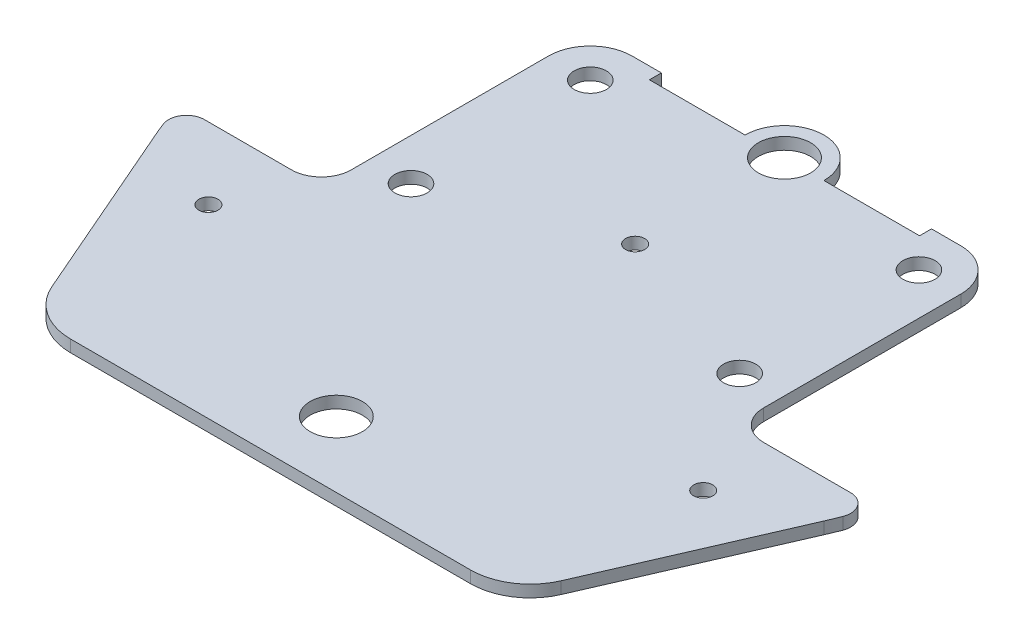
ISO-10303-21;
HEADER;
FILE_DESCRIPTION(('STEP AP214'),'2;1');
FILE_NAME('part.step','',(''),(''),'','','');
FILE_SCHEMA(('AUTOMOTIVE_DESIGN { 1 0 10303 214 1 1 1 1 }'));
ENDSEC;
DATA;
#1=APPLICATION_CONTEXT('core data for automotive mechanical design processes');
#2=APPLICATION_PROTOCOL_DEFINITION('international standard','automotive_design',2000,#1);
#3=PRODUCT_CONTEXT('',#1,'mechanical');
#4=PRODUCT('Part','Part','',(#3));
#5=PRODUCT_RELATED_PRODUCT_CATEGORY('part','',(#4));
#6=PRODUCT_DEFINITION_FORMATION('','',#4);
#7=PRODUCT_DEFINITION_CONTEXT('part definition',#1,'design');
#8=PRODUCT_DEFINITION('design','',#6,#7);
#9=PRODUCT_DEFINITION_SHAPE('','',#8);
#10=(LENGTH_UNIT() NAMED_UNIT(*) SI_UNIT(.MILLI.,.METRE.));
#11=(NAMED_UNIT(*) PLANE_ANGLE_UNIT() SI_UNIT($,.RADIAN.));
#12=(NAMED_UNIT(*) SI_UNIT($,.STERADIAN.) SOLID_ANGLE_UNIT());
#13=UNCERTAINTY_MEASURE_WITH_UNIT(LENGTH_MEASURE(1.E-05),#10,'distance_accuracy_value','');
#14=(GEOMETRIC_REPRESENTATION_CONTEXT(3) GLOBAL_UNCERTAINTY_ASSIGNED_CONTEXT((#13)) GLOBAL_UNIT_ASSIGNED_CONTEXT((#10,
#11,#12)) REPRESENTATION_CONTEXT('',''));
#15=CARTESIAN_POINT('',(0.,0.,0.));
#16=DIRECTION('',(0.,0.,1.));
#17=DIRECTION('',(1.,0.,0.));
#18=AXIS2_PLACEMENT_3D('',#15,#16,#17);
#19=CARTESIAN_POINT('',(34.5,2.,0.));
#20=DIRECTION('',(1.,0.,0.));
#21=DIRECTION('',(0.,0.,-1.));
#22=AXIS2_PLACEMENT_3D('',#19,#20,#21);
#23=PLANE('',#22);
#24=DIRECTION('',(0.,0.,1.));
#25=VECTOR('',#24,1.);
#26=CARTESIAN_POINT('',(34.5,2.,0.));
#27=LINE('',#26,#25);
#28=CARTESIAN_POINT('',(34.5,2.,-20.));
#29=VERTEX_POINT('',#28);
#30=CARTESIAN_POINT('',(34.5,2.,13.));
#31=VERTEX_POINT('',#30);
#32=EDGE_CURVE('E316',#29,#31,#27,.T.);
#33=ORIENTED_EDGE('',*,*,#32,.T.);
#34=DIRECTION('',(0.,1.,0.));
#35=VECTOR('',#34,1.);
#36=CARTESIAN_POINT('',(34.5,0.,13.));
#37=LINE('',#36,#35);
#38=CARTESIAN_POINT('',(34.5,0.,13.));
#39=VERTEX_POINT('',#38);
#40=EDGE_CURVE('E277',#39,#31,#37,.T.);
#41=ORIENTED_EDGE('',*,*,#40,.F.);
#42=DIRECTION('',(0.,0.,1.));
#43=VECTOR('',#42,1.);
#44=CARTESIAN_POINT('',(34.5,0.,0.));
#45=LINE('',#44,#43);
#46=CARTESIAN_POINT('',(34.5,0.,-20.));
#47=VERTEX_POINT('',#46);
#48=EDGE_CURVE('E311',#47,#39,#45,.T.);
#49=ORIENTED_EDGE('',*,*,#48,.F.);
#50=DIRECTION('',(0.,-1.,0.));
#51=VECTOR('',#50,1.);
#52=CARTESIAN_POINT('',(34.5,2.,-20.));
#53=LINE('',#52,#51);
#54=EDGE_CURVE('E419',#29,#47,#53,.T.);
#55=ORIENTED_EDGE('',*,*,#54,.F.);
#56=EDGE_LOOP('',(#33,#41,#49,#55));
#57=FACE_BOUND('',#56,.T.);
#58=ADVANCED_FACE('F81',(#57),#23,.T.);
#59=CARTESIAN_POINT('',(-34.5,2.,0.));
#60=DIRECTION('',(1.,0.,0.));
#61=DIRECTION('',(0.,0.,-1.));
#62=AXIS2_PLACEMENT_3D('',#59,#60,#61);
#63=PLANE('',#62);
#64=DIRECTION('',(0.,1.,0.));
#65=VECTOR('',#64,1.);
#66=CARTESIAN_POINT('',(-34.5,0.,13.));
#67=LINE('',#66,#65);
#68=CARTESIAN_POINT('',(-34.5,0.,13.));
#69=VERTEX_POINT('',#68);
#70=CARTESIAN_POINT('',(-34.5,2.,13.));
#71=VERTEX_POINT('',#70);
#72=EDGE_CURVE('E299',#69,#71,#67,.T.);
#73=ORIENTED_EDGE('',*,*,#72,.T.);
#74=DIRECTION('',(0.,0.,1.));
#75=VECTOR('',#74,1.);
#76=CARTESIAN_POINT('',(-34.5,2.,0.));
#77=LINE('',#76,#75);
#78=CARTESIAN_POINT('',(-34.5,2.,-20.));
#79=VERTEX_POINT('',#78);
#80=EDGE_CURVE('E344',#79,#71,#77,.T.);
#81=ORIENTED_EDGE('',*,*,#80,.F.);
#82=DIRECTION('',(0.,-1.,0.));
#83=VECTOR('',#82,1.);
#84=CARTESIAN_POINT('',(-34.5,2.,-20.));
#85=LINE('',#84,#83);
#86=CARTESIAN_POINT('',(-34.5,0.,-20.));
#87=VERTEX_POINT('',#86);
#88=EDGE_CURVE('E359',#79,#87,#85,.T.);
#89=ORIENTED_EDGE('',*,*,#88,.T.);
#90=DIRECTION('',(0.,0.,1.));
#91=VECTOR('',#90,1.);
#92=CARTESIAN_POINT('',(-34.5,0.,0.));
#93=LINE('',#92,#91);
#94=EDGE_CURVE('E387',#87,#69,#93,.T.);
#95=ORIENTED_EDGE('',*,*,#94,.T.);
#96=EDGE_LOOP('',(#73,#81,#89,#95));
#97=FACE_BOUND('',#96,.T.);
#98=ADVANCED_FACE('F468',(#97),#63,.F.);
#99=CARTESIAN_POINT('',(27.5,2.,-20.));
#100=DIRECTION('',(0.,-1.,0.));
#101=DIRECTION('',(0.,0.,-1.));
#102=AXIS2_PLACEMENT_3D('',#99,#100,#101);
#103=CYLINDRICAL_SURFACE('',#102,6.99999999999999);
#104=CARTESIAN_POINT('',(27.5,0.,-20.));
#105=DIRECTION('',(0.,1.,0.));
#106=DIRECTION('',(0.,0.,1.));
#107=AXIS2_PLACEMENT_3D('',#104,#105,#106);
#108=CIRCLE('',#107,6.99999999999999);
#109=CARTESIAN_POINT('',(27.5,0.,-27.));
#110=VERTEX_POINT('',#109);
#111=EDGE_CURVE('E362',#110,#47,#108,.F.);
#112=ORIENTED_EDGE('',*,*,#111,.F.);
#113=DIRECTION('',(0.,-1.,0.));
#114=VECTOR('',#113,1.);
#115=CARTESIAN_POINT('',(27.5,2.,-27.));
#116=LINE('',#115,#114);
#117=CARTESIAN_POINT('',(27.5,2.,-27.));
#118=VERTEX_POINT('',#117);
#119=EDGE_CURVE('E417',#118,#110,#116,.T.);
#120=ORIENTED_EDGE('',*,*,#119,.F.);
#121=CARTESIAN_POINT('',(27.5,2.,-20.));
#122=DIRECTION('',(0.,1.,0.));
#123=DIRECTION('',(0.,0.,1.));
#124=AXIS2_PLACEMENT_3D('',#121,#122,#123);
#125=CIRCLE('',#124,6.99999999999999);
#126=EDGE_CURVE('E319',#118,#29,#125,.F.);
#127=ORIENTED_EDGE('',*,*,#126,.T.);
#128=ORIENTED_EDGE('',*,*,#54,.T.);
#129=EDGE_LOOP('',(#112,#120,#127,#128));
#130=FACE_BOUND('',#129,.T.);
#131=ADVANCED_FACE('F474',(#130),#103,.T.);
#132=CARTESIAN_POINT('',(0.,2.,-27.0000000000001));
#133=DIRECTION('',(0.,0.,-1.));
#134=DIRECTION('',(-1.,0.,0.));
#135=AXIS2_PLACEMENT_3D('',#132,#133,#134);
#136=PLANE('',#135);
#137=DIRECTION('',(1.,0.,0.));
#138=VECTOR('',#137,1.);
#139=CARTESIAN_POINT('',(0.,0.,-27.0000000000001));
#140=LINE('',#139,#138);
#141=CARTESIAN_POINT('',(22.6010205144336,0.,-27.));
#142=VERTEX_POINT('',#141);
#143=EDGE_CURVE('E365',#142,#110,#140,.T.);
#144=ORIENTED_EDGE('',*,*,#143,.F.);
#145=DIRECTION('',(0.,-1.,0.));
#146=VECTOR('',#145,1.);
#147=CARTESIAN_POINT('',(22.6010205144336,2.,-27.));
#148=LINE('',#147,#146);
#149=CARTESIAN_POINT('',(22.6010205144336,2.,-27.));
#150=VERTEX_POINT('',#149);
#151=EDGE_CURVE('E415',#150,#142,#148,.T.);
#152=ORIENTED_EDGE('',*,*,#151,.F.);
#153=DIRECTION('',(1.,0.,0.));
#154=VECTOR('',#153,1.);
#155=CARTESIAN_POINT('',(0.,2.,-27.0000000000001));
#156=LINE('',#155,#154);
#157=EDGE_CURVE('E323',#150,#118,#156,.T.);
#158=ORIENTED_EDGE('',*,*,#157,.T.);
#159=ORIENTED_EDGE('',*,*,#119,.T.);
#160=EDGE_LOOP('',(#144,#152,#158,#159));
#161=FACE_BOUND('',#160,.T.);
#162=ADVANCED_FACE('F544',(#161),#136,.T.);
#163=CARTESIAN_POINT('',(22.6010205144336,2.,0.));
#164=DIRECTION('',(-1.,0.,0.));
#165=DIRECTION('',(0.,0.,1.));
#166=AXIS2_PLACEMENT_3D('',#163,#164,#165);
#167=PLANE('',#166);
#168=DIRECTION('',(0.,0.,-1.));
#169=VECTOR('',#168,1.);
#170=CARTESIAN_POINT('',(22.6010205144336,0.,0.));
#171=LINE('',#170,#169);
#172=CARTESIAN_POINT('',(22.6010205144336,0.,-25.));
#173=VERTEX_POINT('',#172);
#174=EDGE_CURVE('E368',#173,#142,#171,.T.);
#175=ORIENTED_EDGE('',*,*,#174,.F.);
#176=DIRECTION('',(0.,-1.,0.));
#177=VECTOR('',#176,1.);
#178=CARTESIAN_POINT('',(22.6010205144336,2.,-25.));
#179=LINE('',#178,#177);
#180=CARTESIAN_POINT('',(22.6010205144336,2.,-25.));
#181=VERTEX_POINT('',#180);
#182=EDGE_CURVE('E413',#181,#173,#179,.T.);
#183=ORIENTED_EDGE('',*,*,#182,.F.);
#184=DIRECTION('',(0.,0.,-1.));
#185=VECTOR('',#184,1.);
#186=CARTESIAN_POINT('',(22.6010205144336,2.,0.));
#187=LINE('',#186,#185);
#188=EDGE_CURVE('E326',#181,#150,#187,.T.);
#189=ORIENTED_EDGE('',*,*,#188,.T.);
#190=ORIENTED_EDGE('',*,*,#151,.T.);
#191=EDGE_LOOP('',(#175,#183,#189,#190));
#192=FACE_BOUND('',#191,.T.);
#193=ADVANCED_FACE('F540',(#192),#167,.T.);
#194=CARTESIAN_POINT('',(0.,2.,-25.));
#195=DIRECTION('',(0.,0.,-1.));
#196=DIRECTION('',(-1.,0.,0.));
#197=AXIS2_PLACEMENT_3D('',#194,#195,#196);
#198=PLANE('',#197);
#199=DIRECTION('',(1.,0.,0.));
#200=VECTOR('',#199,1.);
#201=CARTESIAN_POINT('',(0.,0.,-25.));
#202=LINE('',#201,#200);
#203=CARTESIAN_POINT('',(6.60102051443365,0.,-25.));
#204=VERTEX_POINT('',#203);
#205=EDGE_CURVE('E371',#204,#173,#202,.T.);
#206=ORIENTED_EDGE('',*,*,#205,.F.);
#207=DIRECTION('',(0.,-1.,0.));
#208=VECTOR('',#207,1.);
#209=CARTESIAN_POINT('',(6.60102051443365,2.,-25.));
#210=LINE('',#209,#208);
#211=CARTESIAN_POINT('',(6.60102051443365,2.,-25.));
#212=VERTEX_POINT('',#211);
#213=EDGE_CURVE('E411',#212,#204,#210,.T.);
#214=ORIENTED_EDGE('',*,*,#213,.F.);
#215=DIRECTION('',(1.,0.,0.));
#216=VECTOR('',#215,1.);
#217=CARTESIAN_POINT('',(0.,2.,-25.));
#218=LINE('',#217,#216);
#219=EDGE_CURVE('E329',#212,#181,#218,.T.);
#220=ORIENTED_EDGE('',*,*,#219,.T.);
#221=ORIENTED_EDGE('',*,*,#182,.T.);
#222=EDGE_LOOP('',(#206,#214,#220,#221));
#223=FACE_BOUND('',#222,.T.);
#224=ADVANCED_FACE('F536',(#223),#198,.T.);
#225=CARTESIAN_POINT('',(0.,2.,-25.));
#226=DIRECTION('',(0.,-1.,0.));
#227=DIRECTION('',(0.,0.,-1.));
#228=AXIS2_PLACEMENT_3D('',#225,#226,#227);
#229=CYLINDRICAL_SURFACE('',#228,6.60102051443364);
#230=CARTESIAN_POINT('',(0.,0.,-25.));
#231=DIRECTION('',(0.,1.,0.));
#232=DIRECTION('',(0.,0.,1.));
#233=AXIS2_PLACEMENT_3D('',#230,#231,#232);
#234=CIRCLE('',#233,6.60102051443364);
#235=CARTESIAN_POINT('',(-6.60102051443364,0.,-25.));
#236=VERTEX_POINT('',#235);
#237=EDGE_CURVE('E374',#204,#236,#234,.T.);
#238=ORIENTED_EDGE('',*,*,#237,.T.);
#239=DIRECTION('',(0.,-1.,0.));
#240=VECTOR('',#239,1.);
#241=CARTESIAN_POINT('',(-6.60102051443364,2.,-25.));
#242=LINE('',#241,#240);
#243=CARTESIAN_POINT('',(-6.60102051443364,2.,-25.));
#244=VERTEX_POINT('',#243);
#245=EDGE_CURVE('E408',#244,#236,#242,.T.);
#246=ORIENTED_EDGE('',*,*,#245,.F.);
#247=CARTESIAN_POINT('',(0.,2.,-25.));
#248=DIRECTION('',(0.,1.,0.));
#249=DIRECTION('',(0.,0.,1.));
#250=AXIS2_PLACEMENT_3D('',#247,#248,#249);
#251=CIRCLE('',#250,6.60102051443364);
#252=EDGE_CURVE('E332',#212,#244,#251,.T.);
#253=ORIENTED_EDGE('',*,*,#252,.F.);
#254=ORIENTED_EDGE('',*,*,#213,.T.);
#255=EDGE_LOOP('',(#238,#246,#253,#254));
#256=FACE_BOUND('',#255,.T.);
#257=ADVANCED_FACE('F532',(#256),#229,.T.);
#258=CARTESIAN_POINT('',(0.,2.,-25.));
#259=DIRECTION('',(0.,0.,1.));
#260=DIRECTION('',(1.,0.,0.));
#261=AXIS2_PLACEMENT_3D('',#258,#259,#260);
#262=PLANE('',#261);
#263=DIRECTION('',(-1.,0.,0.));
#264=VECTOR('',#263,1.);
#265=CARTESIAN_POINT('',(0.,0.,-25.));
#266=LINE('',#265,#264);
#267=CARTESIAN_POINT('',(-22.6010205144336,0.,-25.));
#268=VERTEX_POINT('',#267);
#269=EDGE_CURVE('E376',#236,#268,#266,.T.);
#270=ORIENTED_EDGE('',*,*,#269,.T.);
#271=DIRECTION('',(0.,-1.,0.));
#272=VECTOR('',#271,1.);
#273=CARTESIAN_POINT('',(-22.6010205144336,2.,-25.));
#274=LINE('',#273,#272);
#275=CARTESIAN_POINT('',(-22.6010205144336,2.,-25.));
#276=VERTEX_POINT('',#275);
#277=EDGE_CURVE('E406',#276,#268,#274,.T.);
#278=ORIENTED_EDGE('',*,*,#277,.F.);
#279=DIRECTION('',(-1.,0.,0.));
#280=VECTOR('',#279,1.);
#281=CARTESIAN_POINT('',(0.,2.,-25.));
#282=LINE('',#281,#280);
#283=EDGE_CURVE('E334',#244,#276,#282,.T.);
#284=ORIENTED_EDGE('',*,*,#283,.F.);
#285=ORIENTED_EDGE('',*,*,#245,.T.);
#286=EDGE_LOOP('',(#270,#278,#284,#285));
#287=FACE_BOUND('',#286,.T.);
#288=ADVANCED_FACE('F528',(#287),#262,.F.);
#289=CARTESIAN_POINT('',(-22.6010205144336,2.,0.));
#290=DIRECTION('',(1.,0.,0.));
#291=DIRECTION('',(0.,0.,-1.));
#292=AXIS2_PLACEMENT_3D('',#289,#290,#291);
#293=PLANE('',#292);
#294=DIRECTION('',(0.,0.,1.));
#295=VECTOR('',#294,1.);
#296=CARTESIAN_POINT('',(-22.6010205144336,0.,0.));
#297=LINE('',#296,#295);
#298=CARTESIAN_POINT('',(-22.6010205144336,0.,-27.));
#299=VERTEX_POINT('',#298);
#300=EDGE_CURVE('E379',#299,#268,#297,.T.);
#301=ORIENTED_EDGE('',*,*,#300,.F.);
#302=DIRECTION('',(0.,-1.,0.));
#303=VECTOR('',#302,1.);
#304=CARTESIAN_POINT('',(-22.6010205144336,2.,-27.));
#305=LINE('',#304,#303);
#306=CARTESIAN_POINT('',(-22.6010205144336,2.,-27.));
#307=VERTEX_POINT('',#306);
#308=EDGE_CURVE('E404',#307,#299,#305,.T.);
#309=ORIENTED_EDGE('',*,*,#308,.F.);
#310=DIRECTION('',(0.,0.,1.));
#311=VECTOR('',#310,1.);
#312=CARTESIAN_POINT('',(-22.6010205144336,2.,0.));
#313=LINE('',#312,#311);
#314=EDGE_CURVE('E336',#307,#276,#313,.T.);
#315=ORIENTED_EDGE('',*,*,#314,.T.);
#316=ORIENTED_EDGE('',*,*,#277,.T.);
#317=EDGE_LOOP('',(#301,#309,#315,#316));
#318=FACE_BOUND('',#317,.T.);
#319=ADVANCED_FACE('F523',(#318),#293,.T.);
#320=CARTESIAN_POINT('',(0.,2.,-27.));
#321=DIRECTION('',(0.,0.,-1.));
#322=DIRECTION('',(-1.,0.,0.));
#323=AXIS2_PLACEMENT_3D('',#320,#321,#322);
#324=PLANE('',#323);
#325=DIRECTION('',(1.,0.,0.));
#326=VECTOR('',#325,1.);
#327=CARTESIAN_POINT('',(0.,0.,-27.));
#328=LINE('',#327,#326);
#329=CARTESIAN_POINT('',(-27.5,0.,-27.));
#330=VERTEX_POINT('',#329);
#331=EDGE_CURVE('E382',#330,#299,#328,.T.);
#332=ORIENTED_EDGE('',*,*,#331,.F.);
#333=DIRECTION('',(0.,-1.,0.));
#334=VECTOR('',#333,1.);
#335=CARTESIAN_POINT('',(-27.5,2.,-27.));
#336=LINE('',#335,#334);
#337=CARTESIAN_POINT('',(-27.5,2.,-27.));
#338=VERTEX_POINT('',#337);
#339=EDGE_CURVE('E402',#338,#330,#336,.T.);
#340=ORIENTED_EDGE('',*,*,#339,.F.);
#341=DIRECTION('',(1.,0.,0.));
#342=VECTOR('',#341,1.);
#343=CARTESIAN_POINT('',(0.,2.,-27.));
#344=LINE('',#343,#342);
#345=EDGE_CURVE('E339',#338,#307,#344,.T.);
#346=ORIENTED_EDGE('',*,*,#345,.T.);
#347=ORIENTED_EDGE('',*,*,#308,.T.);
#348=EDGE_LOOP('',(#332,#340,#346,#347));
#349=FACE_BOUND('',#348,.T.);
#350=ADVANCED_FACE('F518',(#349),#324,.T.);
#351=CARTESIAN_POINT('',(-27.5,2.,-20.));
#352=DIRECTION('',(0.,-1.,0.));
#353=DIRECTION('',(0.,0.,-1.));
#354=AXIS2_PLACEMENT_3D('',#351,#352,#353);
#355=CYLINDRICAL_SURFACE('',#354,6.99999999999999);
#356=CARTESIAN_POINT('',(-27.5,0.,-20.));
#357=DIRECTION('',(0.,1.,0.));
#358=DIRECTION('',(0.,0.,1.));
#359=AXIS2_PLACEMENT_3D('',#356,#357,#358);
#360=CIRCLE('',#359,6.99999999999999);
#361=EDGE_CURVE('E385',#330,#87,#360,.T.);
#362=ORIENTED_EDGE('',*,*,#361,.T.);
#363=ORIENTED_EDGE('',*,*,#88,.F.);
#364=CARTESIAN_POINT('',(-27.5,2.,-20.));
#365=DIRECTION('',(0.,1.,0.));
#366=DIRECTION('',(0.,0.,1.));
#367=AXIS2_PLACEMENT_3D('',#364,#365,#366);
#368=CIRCLE('',#367,6.99999999999999);
#369=EDGE_CURVE('E342',#338,#79,#368,.T.);
#370=ORIENTED_EDGE('',*,*,#369,.F.);
#371=ORIENTED_EDGE('',*,*,#339,.T.);
#372=EDGE_LOOP('',(#362,#363,#370,#371));
#373=FACE_BOUND('',#372,.T.);
#374=ADVANCED_FACE('F515',(#373),#355,.T.);
#375=CARTESIAN_POINT('',(27.5,2.,9.99999999999999));
#376=DIRECTION('',(0.,-1.,0.));
#377=DIRECTION('',(0.,0.,-1.));
#378=AXIS2_PLACEMENT_3D('',#375,#376,#377);
#379=CYLINDRICAL_SURFACE('',#378,2.7);
#380=CARTESIAN_POINT('',(27.5,2.,9.99999999999999));
#381=DIRECTION('',(0.,1.,0.));
#382=DIRECTION('',(0.,0.,1.));
#383=AXIS2_PLACEMENT_3D('',#380,#381,#382);
#384=CIRCLE('',#383,2.7);
#385=CARTESIAN_POINT('',(27.5,2.,12.7));
#386=VERTEX_POINT('',#385);
#387=EDGE_CURVE('E353',#386,#386,#384,.F.);
#388=ORIENTED_EDGE('',*,*,#387,.F.);
#389=EDGE_LOOP('',(#388));
#390=FACE_BOUND('',#389,.T.);
#391=CARTESIAN_POINT('',(27.5,0.,9.99999999999999));
#392=DIRECTION('',(0.,1.,0.));
#393=DIRECTION('',(0.,0.,1.));
#394=AXIS2_PLACEMENT_3D('',#391,#392,#393);
#395=CIRCLE('',#394,2.7);
#396=CARTESIAN_POINT('',(27.5,0.,12.7));
#397=VERTEX_POINT('',#396);
#398=EDGE_CURVE('E395',#397,#397,#395,.F.);
#399=ORIENTED_EDGE('',*,*,#398,.T.);
#400=EDGE_LOOP('',(#399));
#401=FACE_BOUND('',#400,.T.);
#402=ADVANCED_FACE('F652',(#390,#401),#379,.F.);
#403=CARTESIAN_POINT('',(-27.5,2.,10.));
#404=DIRECTION('',(0.,-1.,0.));
#405=DIRECTION('',(0.,0.,-1.));
#406=AXIS2_PLACEMENT_3D('',#403,#404,#405);
#407=CYLINDRICAL_SURFACE('',#406,2.7);
#408=CARTESIAN_POINT('',(-27.5,2.,10.));
#409=DIRECTION('',(0.,1.,0.));
#410=DIRECTION('',(0.,0.,1.));
#411=AXIS2_PLACEMENT_3D('',#408,#409,#410);
#412=CIRCLE('',#411,2.7);
#413=CARTESIAN_POINT('',(-27.5,2.,12.7));
#414=VERTEX_POINT('',#413);
#415=EDGE_CURVE('E350',#414,#414,#412,.T.);
#416=ORIENTED_EDGE('',*,*,#415,.T.);
#417=EDGE_LOOP('',(#416));
#418=FACE_BOUND('',#417,.T.);
#419=CARTESIAN_POINT('',(-27.5,0.,10.));
#420=DIRECTION('',(0.,1.,0.));
#421=DIRECTION('',(0.,0.,1.));
#422=AXIS2_PLACEMENT_3D('',#419,#420,#421);
#423=CIRCLE('',#422,2.7);
#424=CARTESIAN_POINT('',(-27.5,0.,12.7));
#425=VERTEX_POINT('',#424);
#426=EDGE_CURVE('E392',#425,#425,#423,.T.);
#427=ORIENTED_EDGE('',*,*,#426,.F.);
#428=EDGE_LOOP('',(#427));
#429=FACE_BOUND('',#428,.T.);
#430=ADVANCED_FACE('F655',(#418,#429),#407,.F.);
#431=CARTESIAN_POINT('',(-27.5,2.,-20.));
#432=DIRECTION('',(0.,-1.,0.));
#433=DIRECTION('',(0.,0.,-1.));
#434=AXIS2_PLACEMENT_3D('',#431,#432,#433);
#435=CYLINDRICAL_SURFACE('',#434,2.7);
#436=CARTESIAN_POINT('',(-27.5,2.,-20.));
#437=DIRECTION('',(0.,1.,0.));
#438=DIRECTION('',(0.,0.,1.));
#439=AXIS2_PLACEMENT_3D('',#436,#437,#438);
#440=CIRCLE('',#439,2.7);
#441=CARTESIAN_POINT('',(-27.5,2.,-17.3));
#442=VERTEX_POINT('',#441);
#443=EDGE_CURVE('E347',#442,#442,#440,.T.);
#444=ORIENTED_EDGE('',*,*,#443,.T.);
#445=EDGE_LOOP('',(#444));
#446=FACE_BOUND('',#445,.T.);
#447=CARTESIAN_POINT('',(-27.5,0.,-20.));
#448=DIRECTION('',(0.,1.,0.));
#449=DIRECTION('',(0.,0.,1.));
#450=AXIS2_PLACEMENT_3D('',#447,#448,#449);
#451=CIRCLE('',#450,2.7);
#452=CARTESIAN_POINT('',(-27.5,0.,-17.3));
#453=VERTEX_POINT('',#452);
#454=EDGE_CURVE('E389',#453,#453,#451,.T.);
#455=ORIENTED_EDGE('',*,*,#454,.F.);
#456=EDGE_LOOP('',(#455));
#457=FACE_BOUND('',#456,.T.);
#458=ADVANCED_FACE('F650',(#446,#457),#435,.F.);
#459=CARTESIAN_POINT('',(27.5,2.,-20.));
#460=DIRECTION('',(0.,-1.,0.));
#461=DIRECTION('',(0.,0.,-1.));
#462=AXIS2_PLACEMENT_3D('',#459,#460,#461);
#463=CYLINDRICAL_SURFACE('',#462,2.7);
#464=CARTESIAN_POINT('',(27.5,2.,-20.));
#465=DIRECTION('',(0.,1.,0.));
#466=DIRECTION('',(0.,0.,1.));
#467=AXIS2_PLACEMENT_3D('',#464,#465,#466);
#468=CIRCLE('',#467,2.7);
#469=CARTESIAN_POINT('',(27.5,2.,-17.3));
#470=VERTEX_POINT('',#469);
#471=EDGE_CURVE('E356',#470,#470,#468,.F.);
#472=ORIENTED_EDGE('',*,*,#471,.F.);
#473=EDGE_LOOP('',(#472));
#474=FACE_BOUND('',#473,.T.);
#475=CARTESIAN_POINT('',(27.5,0.,-20.));
#476=DIRECTION('',(0.,1.,0.));
#477=DIRECTION('',(0.,0.,1.));
#478=AXIS2_PLACEMENT_3D('',#475,#476,#477);
#479=CIRCLE('',#478,2.7);
#480=CARTESIAN_POINT('',(27.5,0.,-17.3));
#481=VERTEX_POINT('',#480);
#482=EDGE_CURVE('E320',#481,#481,#479,.F.);
#483=ORIENTED_EDGE('',*,*,#482,.T.);
#484=EDGE_LOOP('',(#483));
#485=FACE_BOUND('',#484,.T.);
#486=ADVANCED_FACE('F602',(#474,#485),#463,.F.);
#487=CARTESIAN_POINT('',(0.,2.,0.));
#488=DIRECTION('',(0.,1.,0.));
#489=DIRECTION('',(0.,0.,1.));
#490=AXIS2_PLACEMENT_3D('',#487,#488,#489);
#491=PLANE('',#490);
#492=CARTESIAN_POINT('',(41.4,2.,30.));
#493=DIRECTION('',(0.,1.,0.));
#494=DIRECTION('',(0.,0.,-1.));
#495=AXIS2_PLACEMENT_3D('',#492,#493,#494);
#496=CIRCLE('',#495,1.6);
#497=CARTESIAN_POINT('',(41.4,2.,28.4));
#498=VERTEX_POINT('',#497);
#499=EDGE_CURVE('E580',#498,#498,#496,.T.);
#500=ORIENTED_EDGE('',*,*,#499,.F.);
#501=EDGE_LOOP('',(#500));
#502=FACE_BOUND('',#501,.T.);
#503=CARTESIAN_POINT('',(-41.4,2.,30.));
#504=DIRECTION('',(0.,1.,0.));
#505=DIRECTION('',(0.,0.,1.));
#506=AXIS2_PLACEMENT_3D('',#503,#504,#505);
#507=CIRCLE('',#506,1.6);
#508=CARTESIAN_POINT('',(-41.4,2.,31.6));
#509=VERTEX_POINT('',#508);
#510=EDGE_CURVE('E586',#509,#509,#507,.T.);
#511=ORIENTED_EDGE('',*,*,#510,.F.);
#512=EDGE_LOOP('',(#511));
#513=FACE_BOUND('',#512,.T.);
#514=CARTESIAN_POINT('',(0.,2.,0.));
#515=DIRECTION('',(0.,1.,0.));
#516=DIRECTION('',(0.,0.,1.));
#517=AXIS2_PLACEMENT_3D('',#514,#515,#516);
#518=CIRCLE('',#517,1.6);
#519=CARTESIAN_POINT('',(0.,2.,1.6));
#520=VERTEX_POINT('',#519);
#521=EDGE_CURVE('E568',#520,#520,#518,.T.);
#522=ORIENTED_EDGE('',*,*,#521,.F.);
#523=EDGE_LOOP('',(#522));
#524=FACE_BOUND('',#523,.T.);
#525=CARTESIAN_POINT('',(0.,2.,50.));
#526=DIRECTION('',(0.,1.,0.));
#527=DIRECTION('',(0.,0.,1.));
#528=AXIS2_PLACEMENT_3D('',#525,#526,#527);
#529=CIRCLE('',#528,4.375);
#530=CARTESIAN_POINT('',(0.,2.,54.375));
#531=VERTEX_POINT('',#530);
#532=EDGE_CURVE('E575',#531,#531,#529,.T.);
#533=ORIENTED_EDGE('',*,*,#532,.F.);
#534=EDGE_LOOP('',(#533));
#535=FACE_BOUND('',#534,.T.);
#536=CARTESIAN_POINT('',(0.,2.,-25.));
#537=DIRECTION('',(0.,1.,0.));
#538=DIRECTION('',(0.,0.,1.));
#539=AXIS2_PLACEMENT_3D('',#536,#537,#538);
#540=CIRCLE('',#539,4.375);
#541=CARTESIAN_POINT('',(0.,2.,-20.625));
#542=VERTEX_POINT('',#541);
#543=EDGE_CURVE('E562',#542,#542,#540,.T.);
#544=ORIENTED_EDGE('',*,*,#543,.F.);
#545=EDGE_LOOP('',(#544));
#546=FACE_BOUND('',#545,.T.);
#547=DIRECTION('',(1.,0.,0.));
#548=VECTOR('',#547,1.);
#549=CARTESIAN_POINT('',(0.,2.,61.));
#550=LINE('',#549,#548);
#551=CARTESIAN_POINT('',(-33.4426229508197,2.,61.));
#552=VERTEX_POINT('',#551);
#553=CARTESIAN_POINT('',(33.4426229508197,2.,61.));
#554=VERTEX_POINT('',#553);
#555=EDGE_CURVE('E290',#552,#554,#550,.T.);
#556=ORIENTED_EDGE('',*,*,#555,.T.);
#557=CARTESIAN_POINT('',(33.4426229508197,2.,51.));
#558=DIRECTION('',(0.,1.,0.));
#559=DIRECTION('',(0.,0.,1.));
#560=AXIS2_PLACEMENT_3D('',#557,#558,#559);
#561=CIRCLE('',#560,10.);
#562=CARTESIAN_POINT('',(42.6138313702897,2.,54.9860928396918));
#563=VERTEX_POINT('',#562);
#564=EDGE_CURVE('E250',#554,#563,#561,.T.);
#565=ORIENTED_EDGE('',*,*,#564,.T.);
#566=DIRECTION('',(0.398609283969178,0.,-0.917120841947003));
#567=VECTOR('',#566,1.);
#568=CARTESIAN_POINT('',(55.9443713587671,2.,24.3151663221199));
#569=LINE('',#568,#567);
#570=CARTESIAN_POINT('',(55.9443713587671,2.,24.3151663221201));
#571=VERTEX_POINT('',#570);
#572=EDGE_CURVE('E243',#563,#571,#569,.T.);
#573=ORIENTED_EDGE('',*,*,#572,.T.);
#574=CARTESIAN_POINT('',(0.,2.,0.));
#575=DIRECTION('',(0.,1.,0.));
#576=DIRECTION('',(0.,0.,1.));
#577=AXIS2_PLACEMENT_3D('',#574,#575,#576);
#578=CIRCLE('',#577,61.);
#579=CARTESIAN_POINT('',(56.8612298928076,2.,22.0862068965517));
#580=VERTEX_POINT('',#579);
#581=EDGE_CURVE('E249',#571,#580,#578,.T.);
#582=ORIENTED_EDGE('',*,*,#581,.T.);
#583=CARTESIAN_POINT('',(54.0647759636531,2.,21.));
#584=DIRECTION('',(0.,1.,0.));
#585=DIRECTION('',(0.,0.,1.));
#586=AXIS2_PLACEMENT_3D('',#583,#584,#585);
#587=CIRCLE('',#586,3.);
#588=CARTESIAN_POINT('',(54.0647759636531,2.,18.));
#589=VERTEX_POINT('',#588);
#590=EDGE_CURVE('E424',#580,#589,#587,.T.);
#591=ORIENTED_EDGE('',*,*,#590,.T.);
#592=DIRECTION('',(-1.,0.,0.));
#593=VECTOR('',#592,1.);
#594=CARTESIAN_POINT('',(0.,2.,18.));
#595=LINE('',#594,#593);
#596=CARTESIAN_POINT('',(39.5,2.,18.));
#597=VERTEX_POINT('',#596);
#598=EDGE_CURVE('E275',#589,#597,#595,.T.);
#599=ORIENTED_EDGE('',*,*,#598,.T.);
#600=CARTESIAN_POINT('',(39.5,2.,13.));
#601=DIRECTION('',(0.,1.,0.));
#602=DIRECTION('',(0.,0.,1.));
#603=AXIS2_PLACEMENT_3D('',#600,#601,#602);
#604=CIRCLE('',#603,5.);
#605=EDGE_CURVE('E251',#597,#31,#604,.F.);
#606=ORIENTED_EDGE('',*,*,#605,.T.);
#607=ORIENTED_EDGE('',*,*,#32,.F.);
#608=ORIENTED_EDGE('',*,*,#126,.F.);
#609=ORIENTED_EDGE('',*,*,#157,.F.);
#610=ORIENTED_EDGE('',*,*,#188,.F.);
#611=ORIENTED_EDGE('',*,*,#219,.F.);
#612=ORIENTED_EDGE('',*,*,#252,.T.);
#613=ORIENTED_EDGE('',*,*,#283,.T.);
#614=ORIENTED_EDGE('',*,*,#314,.F.);
#615=ORIENTED_EDGE('',*,*,#345,.F.);
#616=ORIENTED_EDGE('',*,*,#369,.T.);
#617=ORIENTED_EDGE('',*,*,#80,.T.);
#618=CARTESIAN_POINT('',(-39.5,2.,13.));
#619=DIRECTION('',(0.,1.,0.));
#620=DIRECTION('',(0.,0.,1.));
#621=AXIS2_PLACEMENT_3D('',#618,#619,#620);
#622=CIRCLE('',#621,5.);
#623=CARTESIAN_POINT('',(-39.5,2.,18.));
#624=VERTEX_POINT('',#623);
#625=EDGE_CURVE('E266',#71,#624,#622,.F.);
#626=ORIENTED_EDGE('',*,*,#625,.T.);
#627=DIRECTION('',(1.,0.,0.));
#628=VECTOR('',#627,1.);
#629=CARTESIAN_POINT('',(0.,2.,18.));
#630=LINE('',#629,#628);
#631=CARTESIAN_POINT('',(-54.0647759636531,2.,18.));
#632=VERTEX_POINT('',#631);
#633=EDGE_CURVE('E269',#632,#624,#630,.T.);
#634=ORIENTED_EDGE('',*,*,#633,.F.);
#635=CARTESIAN_POINT('',(-54.0647759636531,2.,21.));
#636=DIRECTION('',(0.,1.,0.));
#637=DIRECTION('',(0.,0.,1.));
#638=AXIS2_PLACEMENT_3D('',#635,#636,#637);
#639=CIRCLE('',#638,3.);
#640=CARTESIAN_POINT('',(-56.8612298928076,2.,22.0862068965517));
#641=VERTEX_POINT('',#640);
#642=EDGE_CURVE('E422',#632,#641,#639,.T.);
#643=ORIENTED_EDGE('',*,*,#642,.T.);
#644=CARTESIAN_POINT('',(0.,2.,0.));
#645=DIRECTION('',(0.,1.,0.));
#646=DIRECTION('',(0.,0.,1.));
#647=AXIS2_PLACEMENT_3D('',#644,#645,#646);
#648=CIRCLE('',#647,61.);
#649=CARTESIAN_POINT('',(-55.9443713587671,2.,24.3151663221201));
#650=VERTEX_POINT('',#649);
#651=EDGE_CURVE('E302',#641,#650,#648,.T.);
#652=ORIENTED_EDGE('',*,*,#651,.T.);
#653=DIRECTION('',(-0.398609283969178,0.,-0.917120841947003));
#654=VECTOR('',#653,1.);
#655=CARTESIAN_POINT('',(-55.9443713587671,2.,24.3151663221199));
#656=LINE('',#655,#654);
#657=CARTESIAN_POINT('',(-42.6138313702897,2.,54.9860928396918));
#658=VERTEX_POINT('',#657);
#659=EDGE_CURVE('E305',#658,#650,#656,.T.);
#660=ORIENTED_EDGE('',*,*,#659,.F.);
#661=CARTESIAN_POINT('',(-33.4426229508197,2.,51.));
#662=DIRECTION('',(0.,1.,0.));
#663=DIRECTION('',(0.,0.,1.));
#664=AXIS2_PLACEMENT_3D('',#661,#662,#663);
#665=CIRCLE('',#664,10.);
#666=EDGE_CURVE('E442',#658,#552,#665,.T.);
#667=ORIENTED_EDGE('',*,*,#666,.T.);
#668=EDGE_LOOP('',(#556,#565,#573,#582,#591,#599,#606,#607,#608,#609,#610,#611,#612,#613,#614,
#615,#616,#617,#626,#634,#643,#652,#660,#667));
#669=FACE_BOUND('',#668,.T.);
#670=ORIENTED_EDGE('',*,*,#443,.F.);
#671=EDGE_LOOP('',(#670));
#672=FACE_BOUND('',#671,.T.);
#673=ORIENTED_EDGE('',*,*,#415,.F.);
#674=EDGE_LOOP('',(#673));
#675=FACE_BOUND('',#674,.T.);
#676=ORIENTED_EDGE('',*,*,#387,.T.);
#677=EDGE_LOOP('',(#676));
#678=FACE_BOUND('',#677,.T.);
#679=ORIENTED_EDGE('',*,*,#471,.T.);
#680=EDGE_LOOP('',(#679));
#681=FACE_BOUND('',#680,.T.);
#682=ADVANCED_FACE('F246',(#502,#513,#524,#535,#546,#669,#672,#675,#678,#681),#491,.T.);
#683=CARTESIAN_POINT('',(0.,0.,0.));
#684=DIRECTION('',(0.,1.,0.));
#685=DIRECTION('',(0.,0.,1.));
#686=AXIS2_PLACEMENT_3D('',#683,#684,#685);
#687=PLANE('',#686);
#688=CARTESIAN_POINT('',(41.4,0.,30.));
#689=DIRECTION('',(0.,1.,0.));
#690=DIRECTION('',(0.,0.,-1.));
#691=AXIS2_PLACEMENT_3D('',#688,#689,#690);
#692=CIRCLE('',#691,1.6);
#693=CARTESIAN_POINT('',(41.4,0.,28.4));
#694=VERTEX_POINT('',#693);
#695=EDGE_CURVE('E583',#694,#694,#692,.T.);
#696=ORIENTED_EDGE('',*,*,#695,.T.);
#697=EDGE_LOOP('',(#696));
#698=FACE_BOUND('',#697,.T.);
#699=CARTESIAN_POINT('',(-41.4,0.,30.));
#700=DIRECTION('',(0.,1.,0.));
#701=DIRECTION('',(0.,0.,1.));
#702=AXIS2_PLACEMENT_3D('',#699,#700,#701);
#703=CIRCLE('',#702,1.6);
#704=CARTESIAN_POINT('',(-41.4,0.,31.6));
#705=VERTEX_POINT('',#704);
#706=EDGE_CURVE('E572',#705,#705,#703,.T.);
#707=ORIENTED_EDGE('',*,*,#706,.T.);
#708=EDGE_LOOP('',(#707));
#709=FACE_BOUND('',#708,.T.);
#710=CARTESIAN_POINT('',(0.,0.,0.));
#711=DIRECTION('',(0.,1.,0.));
#712=DIRECTION('',(0.,0.,1.));
#713=AXIS2_PLACEMENT_3D('',#710,#711,#712);
#714=CIRCLE('',#713,1.6);
#715=CARTESIAN_POINT('',(0.,0.,1.6));
#716=VERTEX_POINT('',#715);
#717=EDGE_CURVE('E571',#716,#716,#714,.T.);
#718=ORIENTED_EDGE('',*,*,#717,.T.);
#719=EDGE_LOOP('',(#718));
#720=FACE_BOUND('',#719,.T.);
#721=CARTESIAN_POINT('',(0.,0.,50.));
#722=DIRECTION('',(0.,1.,0.));
#723=DIRECTION('',(0.,0.,1.));
#724=AXIS2_PLACEMENT_3D('',#721,#722,#723);
#725=CIRCLE('',#724,4.375);
#726=CARTESIAN_POINT('',(0.,0.,54.375));
#727=VERTEX_POINT('',#726);
#728=EDGE_CURVE('E565',#727,#727,#725,.T.);
#729=ORIENTED_EDGE('',*,*,#728,.T.);
#730=EDGE_LOOP('',(#729));
#731=FACE_BOUND('',#730,.T.);
#732=CARTESIAN_POINT('',(0.,0.,-25.));
#733=DIRECTION('',(0.,1.,0.));
#734=DIRECTION('',(0.,0.,1.));
#735=AXIS2_PLACEMENT_3D('',#732,#733,#734);
#736=CIRCLE('',#735,4.375);
#737=CARTESIAN_POINT('',(0.,0.,-20.625));
#738=VERTEX_POINT('',#737);
#739=EDGE_CURVE('E285',#738,#738,#736,.T.);
#740=ORIENTED_EDGE('',*,*,#739,.T.);
#741=EDGE_LOOP('',(#740));
#742=FACE_BOUND('',#741,.T.);
#743=DIRECTION('',(0.398609283969178,0.,-0.917120841947003));
#744=VECTOR('',#743,1.);
#745=CARTESIAN_POINT('',(55.9443713587671,0.,24.3151663221199));
#746=LINE('',#745,#744);
#747=CARTESIAN_POINT('',(42.6138313702897,0.,54.9860928396918));
#748=VERTEX_POINT('',#747);
#749=CARTESIAN_POINT('',(55.9443713587671,0.,24.3151663221201));
#750=VERTEX_POINT('',#749);
#751=EDGE_CURVE('E256',#748,#750,#746,.T.);
#752=ORIENTED_EDGE('',*,*,#751,.F.);
#753=CARTESIAN_POINT('',(33.4426229508197,0.,51.));
#754=DIRECTION('',(0.,1.,0.));
#755=DIRECTION('',(0.,0.,1.));
#756=AXIS2_PLACEMENT_3D('',#753,#754,#755);
#757=CIRCLE('',#756,10.);
#758=CARTESIAN_POINT('',(33.4426229508197,0.,61.));
#759=VERTEX_POINT('',#758);
#760=EDGE_CURVE('E89',#748,#759,#757,.F.);
#761=ORIENTED_EDGE('',*,*,#760,.T.);
#762=DIRECTION('',(1.,0.,0.));
#763=VECTOR('',#762,1.);
#764=CARTESIAN_POINT('',(0.,0.,61.));
#765=LINE('',#764,#763);
#766=CARTESIAN_POINT('',(-33.4426229508197,0.,61.));
#767=VERTEX_POINT('',#766);
#768=EDGE_CURVE('E297',#767,#759,#765,.T.);
#769=ORIENTED_EDGE('',*,*,#768,.F.);
#770=CARTESIAN_POINT('',(-33.4426229508197,0.,51.));
#771=DIRECTION('',(0.,1.,0.));
#772=DIRECTION('',(0.,0.,1.));
#773=AXIS2_PLACEMENT_3D('',#770,#771,#772);
#774=CIRCLE('',#773,10.);
#775=CARTESIAN_POINT('',(-42.6138313702897,0.,54.9860928396918));
#776=VERTEX_POINT('',#775);
#777=EDGE_CURVE('E96',#767,#776,#774,.F.);
#778=ORIENTED_EDGE('',*,*,#777,.T.);
#779=DIRECTION('',(-0.398609283969178,0.,-0.917120841947003));
#780=VECTOR('',#779,1.);
#781=CARTESIAN_POINT('',(-55.9443713587671,0.,24.3151663221199));
#782=LINE('',#781,#780);
#783=CARTESIAN_POINT('',(-55.9443713587671,0.,24.3151663221201));
#784=VERTEX_POINT('',#783);
#785=EDGE_CURVE('E295',#776,#784,#782,.T.);
#786=ORIENTED_EDGE('',*,*,#785,.T.);
#787=CARTESIAN_POINT('',(0.,0.,0.));
#788=DIRECTION('',(0.,1.,0.));
#789=DIRECTION('',(0.,0.,1.));
#790=AXIS2_PLACEMENT_3D('',#787,#788,#789);
#791=CIRCLE('',#790,61.);
#792=CARTESIAN_POINT('',(-56.8612298928076,0.,22.0862068965517));
#793=VERTEX_POINT('',#792);
#794=EDGE_CURVE('E292',#793,#784,#791,.T.);
#795=ORIENTED_EDGE('',*,*,#794,.F.);
#796=CARTESIAN_POINT('',(-54.0647759636531,0.,21.));
#797=DIRECTION('',(0.,1.,0.));
#798=DIRECTION('',(0.,0.,1.));
#799=AXIS2_PLACEMENT_3D('',#796,#797,#798);
#800=CIRCLE('',#799,3.);
#801=CARTESIAN_POINT('',(-54.0647759636531,0.,18.));
#802=VERTEX_POINT('',#801);
#803=EDGE_CURVE('E428',#793,#802,#800,.F.);
#804=ORIENTED_EDGE('',*,*,#803,.T.);
#805=DIRECTION('',(1.,0.,0.));
#806=VECTOR('',#805,1.);
#807=CARTESIAN_POINT('',(0.,0.,18.));
#808=LINE('',#807,#806);
#809=CARTESIAN_POINT('',(-39.5,0.,18.));
#810=VERTEX_POINT('',#809);
#811=EDGE_CURVE('E289',#802,#810,#808,.T.);
#812=ORIENTED_EDGE('',*,*,#811,.T.);
#813=CARTESIAN_POINT('',(-39.5,0.,13.));
#814=DIRECTION('',(0.,1.,0.));
#815=DIRECTION('',(0.,0.,1.));
#816=AXIS2_PLACEMENT_3D('',#813,#814,#815);
#817=CIRCLE('',#816,5.);
#818=EDGE_CURVE('E286',#69,#810,#817,.F.);
#819=ORIENTED_EDGE('',*,*,#818,.F.);
#820=ORIENTED_EDGE('',*,*,#94,.F.);
#821=ORIENTED_EDGE('',*,*,#361,.F.);
#822=ORIENTED_EDGE('',*,*,#331,.T.);
#823=ORIENTED_EDGE('',*,*,#300,.T.);
#824=ORIENTED_EDGE('',*,*,#269,.F.);
#825=ORIENTED_EDGE('',*,*,#237,.F.);
#826=ORIENTED_EDGE('',*,*,#205,.T.);
#827=ORIENTED_EDGE('',*,*,#174,.T.);
#828=ORIENTED_EDGE('',*,*,#143,.T.);
#829=ORIENTED_EDGE('',*,*,#111,.T.);
#830=ORIENTED_EDGE('',*,*,#48,.T.);
#831=CARTESIAN_POINT('',(39.5,0.,13.));
#832=DIRECTION('',(0.,1.,0.));
#833=DIRECTION('',(0.,0.,1.));
#834=AXIS2_PLACEMENT_3D('',#831,#832,#833);
#835=CIRCLE('',#834,5.);
#836=CARTESIAN_POINT('',(39.5,0.,18.));
#837=VERTEX_POINT('',#836);
#838=EDGE_CURVE('E260',#837,#39,#835,.F.);
#839=ORIENTED_EDGE('',*,*,#838,.F.);
#840=DIRECTION('',(-1.,0.,0.));
#841=VECTOR('',#840,1.);
#842=CARTESIAN_POINT('',(0.,0.,18.));
#843=LINE('',#842,#841);
#844=CARTESIAN_POINT('',(54.0647759636531,0.,18.));
#845=VERTEX_POINT('',#844);
#846=EDGE_CURVE('E283',#845,#837,#843,.T.);
#847=ORIENTED_EDGE('',*,*,#846,.F.);
#848=CARTESIAN_POINT('',(54.0647759636531,0.,21.));
#849=DIRECTION('',(0.,1.,0.));
#850=DIRECTION('',(0.,0.,1.));
#851=AXIS2_PLACEMENT_3D('',#848,#849,#850);
#852=CIRCLE('',#851,3.);
#853=CARTESIAN_POINT('',(56.8612298928076,0.,22.0862068965517));
#854=VERTEX_POINT('',#853);
#855=EDGE_CURVE('E430',#845,#854,#852,.F.);
#856=ORIENTED_EDGE('',*,*,#855,.T.);
#857=CARTESIAN_POINT('',(0.,0.,0.));
#858=DIRECTION('',(0.,1.,0.));
#859=DIRECTION('',(0.,0.,1.));
#860=AXIS2_PLACEMENT_3D('',#857,#858,#859);
#861=CIRCLE('',#860,61.);
#862=EDGE_CURVE('E278',#750,#854,#861,.T.);
#863=ORIENTED_EDGE('',*,*,#862,.F.);
#864=EDGE_LOOP('',(#752,#761,#769,#778,#786,#795,#804,#812,#819,#820,#821,#822,#823,#824,#825,
#826,#827,#828,#829,#830,#839,#847,#856,#863));
#865=FACE_BOUND('',#864,.T.);
#866=ORIENTED_EDGE('',*,*,#454,.T.);
#867=EDGE_LOOP('',(#866));
#868=FACE_BOUND('',#867,.T.);
#869=ORIENTED_EDGE('',*,*,#426,.T.);
#870=EDGE_LOOP('',(#869));
#871=FACE_BOUND('',#870,.T.);
#872=ORIENTED_EDGE('',*,*,#398,.F.);
#873=EDGE_LOOP('',(#872));
#874=FACE_BOUND('',#873,.T.);
#875=ORIENTED_EDGE('',*,*,#482,.F.);
#876=EDGE_LOOP('',(#875));
#877=FACE_BOUND('',#876,.T.);
#878=ADVANCED_FACE('F447',(#698,#709,#720,#731,#742,#865,#868,#871,#874,#877),#687,.F.);
#879=CARTESIAN_POINT('',(0.,0.,61.));
#880=DIRECTION('',(0.,0.,1.));
#881=DIRECTION('',(1.,0.,0.));
#882=AXIS2_PLACEMENT_3D('',#879,#880,#881);
#883=PLANE('',#882);
#884=ORIENTED_EDGE('',*,*,#768,.T.);
#885=DIRECTION('',(0.,1.,0.));
#886=VECTOR('',#885,1.);
#887=CARTESIAN_POINT('',(33.4426229508197,0.,61.));
#888=LINE('',#887,#886);
#889=EDGE_CURVE('E439',#759,#554,#888,.T.);
#890=ORIENTED_EDGE('',*,*,#889,.T.);
#891=ORIENTED_EDGE('',*,*,#555,.F.);
#892=DIRECTION('',(0.,1.,0.));
#893=VECTOR('',#892,1.);
#894=CARTESIAN_POINT('',(-33.4426229508197,0.,61.));
#895=LINE('',#894,#893);
#896=EDGE_CURVE('E437',#552,#767,#895,.F.);
#897=ORIENTED_EDGE('',*,*,#896,.T.);
#898=EDGE_LOOP('',(#884,#890,#891,#897));
#899=FACE_BOUND('',#898,.T.);
#900=ADVANCED_FACE('F452',(#899),#883,.T.);
#901=CARTESIAN_POINT('',(-55.9443713587671,0.,24.3151663221199));
#902=DIRECTION('',(0.917120841947003,0.,-0.398609283969178));
#903=DIRECTION('',(-0.398609283969178,0.,-0.917120841947003));
#904=AXIS2_PLACEMENT_3D('',#901,#902,#903);
#905=PLANE('',#904);
#906=ORIENTED_EDGE('',*,*,#785,.F.);
#907=DIRECTION('',(0.,1.,0.));
#908=VECTOR('',#907,1.);
#909=CARTESIAN_POINT('',(-42.6138313702897,2.,54.9860928396918));
#910=LINE('',#909,#908);
#911=EDGE_CURVE('E12',#776,#658,#910,.T.);
#912=ORIENTED_EDGE('',*,*,#911,.T.);
#913=ORIENTED_EDGE('',*,*,#659,.T.);
#914=DIRECTION('',(0.,1.,0.));
#915=VECTOR('',#914,1.);
#916=CARTESIAN_POINT('',(-55.9443713587671,0.,24.3151663221201));
#917=LINE('',#916,#915);
#918=EDGE_CURVE('E308',#784,#650,#917,.T.);
#919=ORIENTED_EDGE('',*,*,#918,.F.);
#920=EDGE_LOOP('',(#906,#912,#913,#919));
#921=FACE_BOUND('',#920,.T.);
#922=ADVANCED_FACE('F633',(#921),#905,.F.);
#923=CARTESIAN_POINT('',(0.,0.,0.));
#924=DIRECTION('',(0.,1.,0.));
#925=DIRECTION('',(0.,0.,1.));
#926=AXIS2_PLACEMENT_3D('',#923,#924,#925);
#927=CYLINDRICAL_SURFACE('',#926,61.);
#928=ORIENTED_EDGE('',*,*,#651,.F.);
#929=DIRECTION('',(0.,1.,0.));
#930=VECTOR('',#929,1.);
#931=CARTESIAN_POINT('',(-56.8612298928076,0.,22.0862068965517));
#932=LINE('',#931,#930);
#933=EDGE_CURVE('E435',#641,#793,#932,.F.);
#934=ORIENTED_EDGE('',*,*,#933,.T.);
#935=ORIENTED_EDGE('',*,*,#794,.T.);
#936=ORIENTED_EDGE('',*,*,#918,.T.);
#937=EDGE_LOOP('',(#928,#934,#935,#936));
#938=FACE_BOUND('',#937,.T.);
#939=ADVANCED_FACE('F636',(#938),#927,.T.);
#940=CARTESIAN_POINT('',(0.,0.,18.));
#941=DIRECTION('',(0.,0.,1.));
#942=DIRECTION('',(1.,0.,0.));
#943=AXIS2_PLACEMENT_3D('',#940,#941,#942);
#944=PLANE('',#943);
#945=ORIENTED_EDGE('',*,*,#811,.F.);
#946=DIRECTION('',(0.,-1.,0.));
#947=VECTOR('',#946,1.);
#948=CARTESIAN_POINT('',(-54.0647759636531,2.,18.));
#949=LINE('',#948,#947);
#950=EDGE_CURVE('E432',#802,#632,#949,.F.);
#951=ORIENTED_EDGE('',*,*,#950,.T.);
#952=ORIENTED_EDGE('',*,*,#633,.T.);
#953=DIRECTION('',(0.,1.,0.));
#954=VECTOR('',#953,1.);
#955=CARTESIAN_POINT('',(-39.5,0.,18.));
#956=LINE('',#955,#954);
#957=EDGE_CURVE('E312',#810,#624,#956,.T.);
#958=ORIENTED_EDGE('',*,*,#957,.F.);
#959=EDGE_LOOP('',(#945,#951,#952,#958));
#960=FACE_BOUND('',#959,.T.);
#961=ADVANCED_FACE('F502',(#960),#944,.F.);
#962=CARTESIAN_POINT('',(-39.5,0.,13.));
#963=DIRECTION('',(0.,1.,0.));
#964=DIRECTION('',(0.,0.,1.));
#965=AXIS2_PLACEMENT_3D('',#962,#963,#964);
#966=CYLINDRICAL_SURFACE('',#965,5.);
#967=ORIENTED_EDGE('',*,*,#625,.F.);
#968=ORIENTED_EDGE('',*,*,#72,.F.);
#969=ORIENTED_EDGE('',*,*,#818,.T.);
#970=ORIENTED_EDGE('',*,*,#957,.T.);
#971=EDGE_LOOP('',(#967,#968,#969,#970));
#972=FACE_BOUND('',#971,.T.);
#973=ADVANCED_FACE('F507',(#972),#966,.F.);
#974=CARTESIAN_POINT('',(0.,0.,18.));
#975=DIRECTION('',(0.,0.,-1.));
#976=DIRECTION('',(-1.,0.,0.));
#977=AXIS2_PLACEMENT_3D('',#974,#975,#976);
#978=PLANE('',#977);
#979=ORIENTED_EDGE('',*,*,#598,.F.);
#980=DIRECTION('',(0.,1.,0.));
#981=VECTOR('',#980,1.);
#982=CARTESIAN_POINT('',(54.0647759636531,0.,18.));
#983=LINE('',#982,#981);
#984=EDGE_CURVE('E426',#589,#845,#983,.F.);
#985=ORIENTED_EDGE('',*,*,#984,.T.);
#986=ORIENTED_EDGE('',*,*,#846,.T.);
#987=DIRECTION('',(0.,1.,0.));
#988=VECTOR('',#987,1.);
#989=CARTESIAN_POINT('',(39.5,0.,18.));
#990=LINE('',#989,#988);
#991=EDGE_CURVE('E280',#837,#597,#990,.T.);
#992=ORIENTED_EDGE('',*,*,#991,.T.);
#993=EDGE_LOOP('',(#979,#985,#986,#992));
#994=FACE_BOUND('',#993,.T.);
#995=ADVANCED_FACE('F622',(#994),#978,.T.);
#996=CARTESIAN_POINT('',(0.,0.,0.));
#997=DIRECTION('',(0.,1.,0.));
#998=DIRECTION('',(0.,0.,1.));
#999=AXIS2_PLACEMENT_3D('',#996,#997,#998);
#1000=CYLINDRICAL_SURFACE('',#999,61.);
#1001=ORIENTED_EDGE('',*,*,#862,.T.);
#1002=DIRECTION('',(0.,1.,0.));
#1003=VECTOR('',#1002,1.);
#1004=CARTESIAN_POINT('',(56.8612298928076,0.,22.0862068965517));
#1005=LINE('',#1004,#1003);
#1006=EDGE_CURVE('E265',#854,#580,#1005,.T.);
#1007=ORIENTED_EDGE('',*,*,#1006,.T.);
#1008=ORIENTED_EDGE('',*,*,#581,.F.);
#1009=DIRECTION('',(0.,1.,0.));
#1010=VECTOR('',#1009,1.);
#1011=CARTESIAN_POINT('',(55.9443713587671,0.,24.3151663221201));
#1012=LINE('',#1011,#1010);
#1013=EDGE_CURVE('E254',#750,#571,#1012,.T.);
#1014=ORIENTED_EDGE('',*,*,#1013,.F.);
#1015=EDGE_LOOP('',(#1001,#1007,#1008,#1014));
#1016=FACE_BOUND('',#1015,.T.);
#1017=ADVANCED_FACE('F263',(#1016),#1000,.T.);
#1018=CARTESIAN_POINT('',(55.9443713587671,0.,24.3151663221199));
#1019=DIRECTION('',(0.917120841947003,0.,0.398609283969178));
#1020=DIRECTION('',(0.398609283969178,0.,-0.917120841947003));
#1021=AXIS2_PLACEMENT_3D('',#1018,#1019,#1020);
#1022=PLANE('',#1021);
#1023=ORIENTED_EDGE('',*,*,#572,.F.);
#1024=DIRECTION('',(0.,1.,0.));
#1025=VECTOR('',#1024,1.);
#1026=CARTESIAN_POINT('',(42.6138313702897,0.,54.9860928396918));
#1027=LINE('',#1026,#1025);
#1028=EDGE_CURVE('E104',#563,#748,#1027,.F.);
#1029=ORIENTED_EDGE('',*,*,#1028,.T.);
#1030=ORIENTED_EDGE('',*,*,#751,.T.);
#1031=ORIENTED_EDGE('',*,*,#1013,.T.);
#1032=EDGE_LOOP('',(#1023,#1029,#1030,#1031));
#1033=FACE_BOUND('',#1032,.T.);
#1034=ADVANCED_FACE('F255',(#1033),#1022,.T.);
#1035=CARTESIAN_POINT('',(39.5,0.,13.));
#1036=DIRECTION('',(0.,1.,0.));
#1037=DIRECTION('',(0.,0.,1.));
#1038=AXIS2_PLACEMENT_3D('',#1035,#1036,#1037);
#1039=CYLINDRICAL_SURFACE('',#1038,5.);
#1040=ORIENTED_EDGE('',*,*,#605,.F.);
#1041=ORIENTED_EDGE('',*,*,#991,.F.);
#1042=ORIENTED_EDGE('',*,*,#838,.T.);
#1043=ORIENTED_EDGE('',*,*,#40,.T.);
#1044=EDGE_LOOP('',(#1040,#1041,#1042,#1043));
#1045=FACE_BOUND('',#1044,.T.);
#1046=ADVANCED_FACE('F483',(#1045),#1039,.F.);
#1047=CARTESIAN_POINT('',(54.0647759636531,0.,21.));
#1048=DIRECTION('',(0.,1.,0.));
#1049=DIRECTION('',(0.,0.,1.));
#1050=AXIS2_PLACEMENT_3D('',#1047,#1048,#1049);
#1051=CYLINDRICAL_SURFACE('',#1050,3.);
#1052=ORIENTED_EDGE('',*,*,#855,.F.);
#1053=ORIENTED_EDGE('',*,*,#984,.F.);
#1054=ORIENTED_EDGE('',*,*,#590,.F.);
#1055=ORIENTED_EDGE('',*,*,#1006,.F.);
#1056=EDGE_LOOP('',(#1052,#1053,#1054,#1055));
#1057=FACE_BOUND('',#1056,.T.);
#1058=ADVANCED_FACE('F480',(#1057),#1051,.T.);
#1059=CARTESIAN_POINT('',(-54.0647759636531,0.,21.));
#1060=DIRECTION('',(0.,1.,0.));
#1061=DIRECTION('',(0.,0.,1.));
#1062=AXIS2_PLACEMENT_3D('',#1059,#1060,#1061);
#1063=CYLINDRICAL_SURFACE('',#1062,3.);
#1064=ORIENTED_EDGE('',*,*,#803,.F.);
#1065=ORIENTED_EDGE('',*,*,#933,.F.);
#1066=ORIENTED_EDGE('',*,*,#642,.F.);
#1067=ORIENTED_EDGE('',*,*,#950,.F.);
#1068=EDGE_LOOP('',(#1064,#1065,#1066,#1067));
#1069=FACE_BOUND('',#1068,.T.);
#1070=ADVANCED_FACE('F482',(#1069),#1063,.T.);
#1071=CARTESIAN_POINT('',(0.,0.,-25.));
#1072=DIRECTION('',(0.,1.,0.));
#1073=DIRECTION('',(0.,0.,1.));
#1074=AXIS2_PLACEMENT_3D('',#1071,#1072,#1073);
#1075=CYLINDRICAL_SURFACE('',#1074,4.375);
#1076=ORIENTED_EDGE('',*,*,#739,.F.);
#1077=EDGE_LOOP('',(#1076));
#1078=FACE_BOUND('',#1077,.T.);
#1079=ORIENTED_EDGE('',*,*,#543,.T.);
#1080=EDGE_LOOP('',(#1079));
#1081=FACE_BOUND('',#1080,.T.);
#1082=ADVANCED_FACE('F486',(#1078,#1081),#1075,.F.);
#1083=CARTESIAN_POINT('',(0.,0.,50.));
#1084=DIRECTION('',(0.,1.,0.));
#1085=DIRECTION('',(0.,0.,1.));
#1086=AXIS2_PLACEMENT_3D('',#1083,#1084,#1085);
#1087=CYLINDRICAL_SURFACE('',#1086,4.375);
#1088=ORIENTED_EDGE('',*,*,#728,.F.);
#1089=EDGE_LOOP('',(#1088));
#1090=FACE_BOUND('',#1089,.T.);
#1091=ORIENTED_EDGE('',*,*,#532,.T.);
#1092=EDGE_LOOP('',(#1091));
#1093=FACE_BOUND('',#1092,.T.);
#1094=ADVANCED_FACE('F491',(#1090,#1093),#1087,.F.);
#1095=CARTESIAN_POINT('',(0.,0.,0.));
#1096=DIRECTION('',(0.,1.,0.));
#1097=DIRECTION('',(0.,0.,1.));
#1098=AXIS2_PLACEMENT_3D('',#1095,#1096,#1097);
#1099=CYLINDRICAL_SURFACE('',#1098,1.6);
#1100=ORIENTED_EDGE('',*,*,#717,.F.);
#1101=EDGE_LOOP('',(#1100));
#1102=FACE_BOUND('',#1101,.T.);
#1103=ORIENTED_EDGE('',*,*,#521,.T.);
#1104=EDGE_LOOP('',(#1103));
#1105=FACE_BOUND('',#1104,.T.);
#1106=ADVANCED_FACE('F596',(#1102,#1105),#1099,.F.);
#1107=CARTESIAN_POINT('',(-41.4,0.,30.));
#1108=DIRECTION('',(0.,1.,0.));
#1109=DIRECTION('',(0.,0.,1.));
#1110=AXIS2_PLACEMENT_3D('',#1107,#1108,#1109);
#1111=CYLINDRICAL_SURFACE('',#1110,1.6);
#1112=ORIENTED_EDGE('',*,*,#706,.F.);
#1113=EDGE_LOOP('',(#1112));
#1114=FACE_BOUND('',#1113,.T.);
#1115=ORIENTED_EDGE('',*,*,#510,.T.);
#1116=EDGE_LOOP('',(#1115));
#1117=FACE_BOUND('',#1116,.T.);
#1118=ADVANCED_FACE('F463',(#1114,#1117),#1111,.F.);
#1119=CARTESIAN_POINT('',(41.4,0.,30.));
#1120=DIRECTION('',(0.,1.,0.));
#1121=DIRECTION('',(0.,0.,1.));
#1122=AXIS2_PLACEMENT_3D('',#1119,#1120,#1121);
#1123=CYLINDRICAL_SURFACE('',#1122,1.6);
#1124=ORIENTED_EDGE('',*,*,#695,.F.);
#1125=EDGE_LOOP('',(#1124));
#1126=FACE_BOUND('',#1125,.T.);
#1127=ORIENTED_EDGE('',*,*,#499,.T.);
#1128=EDGE_LOOP('',(#1127));
#1129=FACE_BOUND('',#1128,.T.);
#1130=ADVANCED_FACE('F457',(#1126,#1129),#1123,.F.);
#1131=CARTESIAN_POINT('',(33.4426229508197,0.,51.));
#1132=DIRECTION('',(0.,1.,0.));
#1133=DIRECTION('',(0.,0.,1.));
#1134=AXIS2_PLACEMENT_3D('',#1131,#1132,#1133);
#1135=CYLINDRICAL_SURFACE('',#1134,10.);
#1136=ORIENTED_EDGE('',*,*,#760,.F.);
#1137=ORIENTED_EDGE('',*,*,#1028,.F.);
#1138=ORIENTED_EDGE('',*,*,#564,.F.);
#1139=ORIENTED_EDGE('',*,*,#889,.F.);
#1140=EDGE_LOOP('',(#1136,#1137,#1138,#1139));
#1141=FACE_BOUND('',#1140,.T.);
#1142=ADVANCED_FACE('F455',(#1141),#1135,.T.);
#1143=CARTESIAN_POINT('',(-33.4426229508197,0.,51.));
#1144=DIRECTION('',(0.,-1.,0.));
#1145=DIRECTION('',(0.,0.,-1.));
#1146=AXIS2_PLACEMENT_3D('',#1143,#1144,#1145);
#1147=CYLINDRICAL_SURFACE('',#1146,10.);
#1148=ORIENTED_EDGE('',*,*,#777,.F.);
#1149=ORIENTED_EDGE('',*,*,#896,.F.);
#1150=ORIENTED_EDGE('',*,*,#666,.F.);
#1151=ORIENTED_EDGE('',*,*,#911,.F.);
#1152=EDGE_LOOP('',(#1148,#1149,#1150,#1151));
#1153=FACE_BOUND('',#1152,.T.);
#1154=ADVANCED_FACE('F83',(#1153),#1147,.T.);
#1155=CLOSED_SHELL('',(#58,#98,#131,#162,#193,#224,#257,#288,#319,#350,#374,#402,#430,#458,#486,
#682,#878,#900,#922,#939,#961,#973,#995,#1017,#1034,#1046,#1058,#1070,#1082,#1094,#1106,#1118,
#1130,#1142,#1154));
#1156=MANIFOLD_SOLID_BREP('B2',#1155);
#1157=ADVANCED_BREP_SHAPE_REPRESENTATION('',(#18,#1156),#14);
#1158=SHAPE_DEFINITION_REPRESENTATION(#9,#1157);
ENDSEC;
END-ISO-10303-21;
